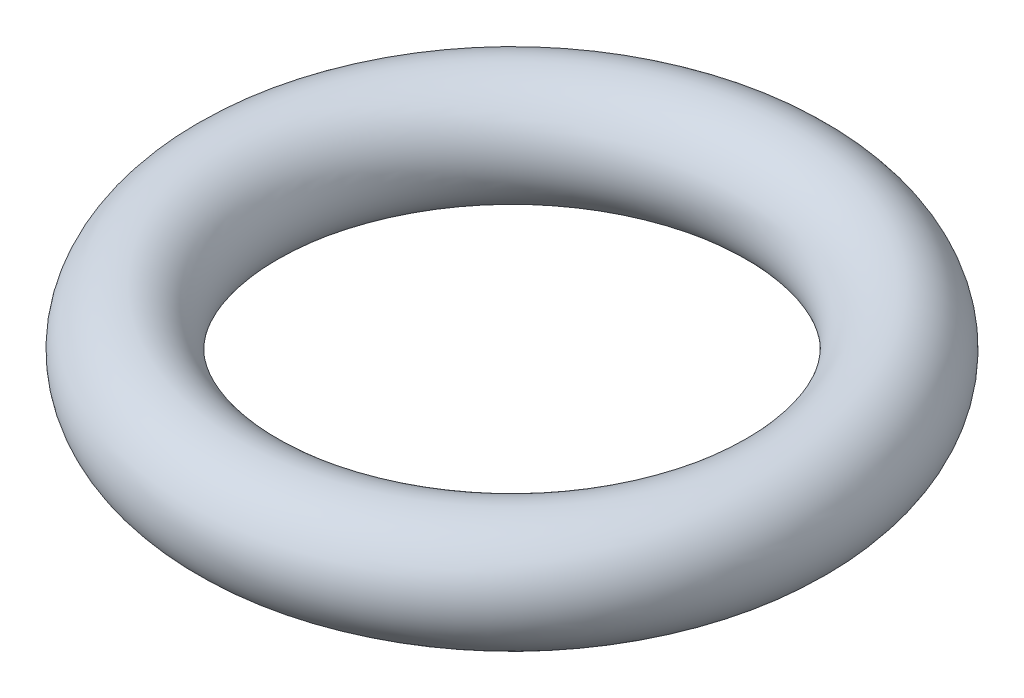
ISO-10303-21;
HEADER;
FILE_DESCRIPTION(('STEP AP214'),'2;1');
FILE_NAME('part.step','',(''),(''),'','','');
FILE_SCHEMA(('AUTOMOTIVE_DESIGN { 1 0 10303 214 1 1 1 1 }'));
ENDSEC;
DATA;
#1=APPLICATION_CONTEXT('core data for automotive mechanical design processes');
#2=APPLICATION_PROTOCOL_DEFINITION('international standard','automotive_design',2000,#1);
#3=PRODUCT_CONTEXT('',#1,'mechanical');
#4=PRODUCT('Part','Part','',(#3));
#5=PRODUCT_RELATED_PRODUCT_CATEGORY('part','',(#4));
#6=PRODUCT_DEFINITION_FORMATION('','',#4);
#7=PRODUCT_DEFINITION_CONTEXT('part definition',#1,'design');
#8=PRODUCT_DEFINITION('design','',#6,#7);
#9=PRODUCT_DEFINITION_SHAPE('','',#8);
#10=(LENGTH_UNIT() NAMED_UNIT(*) SI_UNIT(.MILLI.,.METRE.));
#11=(NAMED_UNIT(*) PLANE_ANGLE_UNIT() SI_UNIT($,.RADIAN.));
#12=(NAMED_UNIT(*) SI_UNIT($,.STERADIAN.) SOLID_ANGLE_UNIT());
#13=UNCERTAINTY_MEASURE_WITH_UNIT(LENGTH_MEASURE(1.E-05),#10,'distance_accuracy_value','');
#14=(GEOMETRIC_REPRESENTATION_CONTEXT(3) GLOBAL_UNCERTAINTY_ASSIGNED_CONTEXT((#13)) GLOBAL_UNIT_ASSIGNED_CONTEXT((#10,
#11,#12)) REPRESENTATION_CONTEXT('',''));
#15=CARTESIAN_POINT('',(0.,0.,0.));
#16=DIRECTION('',(0.,0.,1.));
#17=DIRECTION('',(1.,0.,0.));
#18=AXIS2_PLACEMENT_3D('',#15,#16,#17);
#19=CARTESIAN_POINT('',(0.,0.,0.));
#20=DIRECTION('',(0.,1.,0.));
#21=DIRECTION('',(0.,0.,1.));
#22=AXIS2_PLACEMENT_3D('',#19,#20,#21);
#23=TOROIDAL_SURFACE('',#22,3.925,0.800000000000001);
#24=CARTESIAN_POINT('',(3.925,0.,0.));
#25=DIRECTION('',(0.,0.,1.));
#26=DIRECTION('',(1.,0.,0.));
#27=AXIS2_PLACEMENT_3D('',#24,#25,#26);
#28=CIRCLE('',#27,0.800000000000001);
#29=CARTESIAN_POINT('',(4.725,0.,0.));
#30=VERTEX_POINT('',#29);
#31=EDGE_CURVE('E10',#30,#30,#28,.T.);
#32=CARTESIAN_POINT('',(0.,0.,0.));
#33=DIRECTION('',(0.,1.,0.));
#34=DIRECTION('',(0.,0.,1.));
#35=AXIS2_PLACEMENT_3D('',#32,#33,#34);
#36=CIRCLE('',#35,4.725);
#37=EDGE_CURVE('',#30,#30,#36,.T.);
#38=ORIENTED_EDGE('',*,*,#31,.F.);
#39=ORIENTED_EDGE('',*,*,#31,.T.);
#40=ORIENTED_EDGE('',*,*,#37,.T.);
#41=ORIENTED_EDGE('',*,*,#37,.F.);
#42=EDGE_LOOP('',(#38,#40,#39,#41));
#43=FACE_BOUND('',#42,.T.);
#44=ADVANCED_FACE('F30',(#43),#23,.T.);
#45=CLOSED_SHELL('',(#44));
#46=MANIFOLD_SOLID_BREP('B2',#45);
#47=ADVANCED_BREP_SHAPE_REPRESENTATION('',(#18,#46),#14);
#48=SHAPE_DEFINITION_REPRESENTATION(#9,#47);
ENDSEC;
END-ISO-10303-21;
